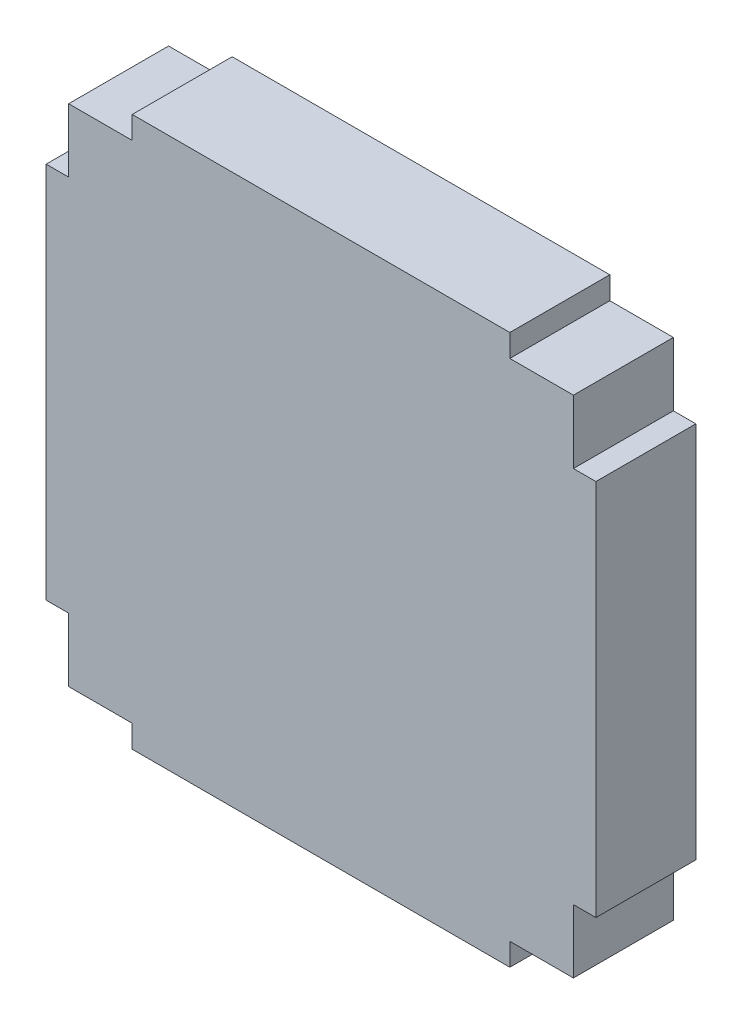
ISO-10303-21;
HEADER;
FILE_DESCRIPTION(('STEP AP214'),'2;1');
FILE_NAME('part.step','',(''),(''),'','','');
FILE_SCHEMA(('AUTOMOTIVE_DESIGN { 1 0 10303 214 1 1 1 1 }'));
ENDSEC;
DATA;
#1=APPLICATION_CONTEXT('core data for automotive mechanical design processes');
#2=APPLICATION_PROTOCOL_DEFINITION('international standard','automotive_design',2000,#1);
#3=PRODUCT_CONTEXT('',#1,'mechanical');
#4=PRODUCT('Part','Part','',(#3));
#5=PRODUCT_RELATED_PRODUCT_CATEGORY('part','',(#4));
#6=PRODUCT_DEFINITION_FORMATION('','',#4);
#7=PRODUCT_DEFINITION_CONTEXT('part definition',#1,'design');
#8=PRODUCT_DEFINITION('design','',#6,#7);
#9=PRODUCT_DEFINITION_SHAPE('','',#8);
#10=(LENGTH_UNIT() NAMED_UNIT(*) SI_UNIT(.MILLI.,.METRE.));
#11=(NAMED_UNIT(*) PLANE_ANGLE_UNIT() SI_UNIT($,.RADIAN.));
#12=(NAMED_UNIT(*) SI_UNIT($,.STERADIAN.) SOLID_ANGLE_UNIT());
#13=UNCERTAINTY_MEASURE_WITH_UNIT(LENGTH_MEASURE(1.E-05),#10,'distance_accuracy_value','');
#14=(GEOMETRIC_REPRESENTATION_CONTEXT(3) GLOBAL_UNCERTAINTY_ASSIGNED_CONTEXT((#13)) GLOBAL_UNIT_ASSIGNED_CONTEXT((#10,
#11,#12)) REPRESENTATION_CONTEXT('',''));
#15=CARTESIAN_POINT('',(0.,0.,0.));
#16=DIRECTION('',(0.,0.,1.));
#17=DIRECTION('',(1.,0.,0.));
#18=AXIS2_PLACEMENT_3D('',#15,#16,#17);
#19=CARTESIAN_POINT('',(0.,0.,1.));
#20=DIRECTION('',(0.,0.,1.));
#21=DIRECTION('',(1.,0.,0.));
#22=AXIS2_PLACEMENT_3D('',#19,#20,#21);
#23=PLANE('',#22);
#24=DIRECTION('',(0.,1.,0.));
#25=VECTOR('',#24,1.);
#26=CARTESIAN_POINT('',(-1.889,0.,1.));
#27=LINE('',#26,#25);
#28=CARTESIAN_POINT('',(-1.889,-2.525,1.));
#29=VERTEX_POINT('',#28);
#30=CARTESIAN_POINT('',(-1.889,-2.75,1.));
#31=VERTEX_POINT('',#30);
#32=EDGE_CURVE('E172',#29,#31,#27,.F.);
#33=ORIENTED_EDGE('',*,*,#32,.T.);
#34=DIRECTION('',(1.,0.,0.));
#35=VECTOR('',#34,1.);
#36=CARTESIAN_POINT('',(-1.889,-2.75,1.));
#37=LINE('',#36,#35);
#38=CARTESIAN_POINT('',(1.889,-2.75,1.));
#39=VERTEX_POINT('',#38);
#40=EDGE_CURVE('E176',#39,#31,#37,.F.);
#41=ORIENTED_EDGE('',*,*,#40,.F.);
#42=DIRECTION('',(0.,1.,0.));
#43=VECTOR('',#42,1.);
#44=CARTESIAN_POINT('',(1.889,-2.75,1.));
#45=LINE('',#44,#43);
#46=CARTESIAN_POINT('',(1.889,-2.525,1.));
#47=VERTEX_POINT('',#46);
#48=EDGE_CURVE('E179',#47,#39,#45,.F.);
#49=ORIENTED_EDGE('',*,*,#48,.F.);
#50=DIRECTION('',(1.,0.,0.));
#51=VECTOR('',#50,1.);
#52=CARTESIAN_POINT('',(1.889,-2.525,1.));
#53=LINE('',#52,#51);
#54=CARTESIAN_POINT('',(2.525,-2.525,1.));
#55=VERTEX_POINT('',#54);
#56=EDGE_CURVE('E183',#55,#47,#53,.F.);
#57=ORIENTED_EDGE('',*,*,#56,.F.);
#58=DIRECTION('',(0.,1.,0.));
#59=VECTOR('',#58,1.);
#60=CARTESIAN_POINT('',(2.525,-2.525,1.));
#61=LINE('',#60,#59);
#62=CARTESIAN_POINT('',(2.525,-1.889,1.));
#63=VERTEX_POINT('',#62);
#64=EDGE_CURVE('E187',#63,#55,#61,.F.);
#65=ORIENTED_EDGE('',*,*,#64,.F.);
#66=DIRECTION('',(1.,0.,0.));
#67=VECTOR('',#66,1.);
#68=CARTESIAN_POINT('',(2.525,-1.889,1.));
#69=LINE('',#68,#67);
#70=CARTESIAN_POINT('',(2.75,-1.889,1.));
#71=VERTEX_POINT('',#70);
#72=EDGE_CURVE('E191',#71,#63,#69,.F.);
#73=ORIENTED_EDGE('',*,*,#72,.F.);
#74=DIRECTION('',(0.,1.,0.));
#75=VECTOR('',#74,1.);
#76=CARTESIAN_POINT('',(2.75,-1.889,1.));
#77=LINE('',#76,#75);
#78=CARTESIAN_POINT('',(2.75,1.889,1.));
#79=VERTEX_POINT('',#78);
#80=EDGE_CURVE('E195',#79,#71,#77,.F.);
#81=ORIENTED_EDGE('',*,*,#80,.F.);
#82=DIRECTION('',(1.,0.,0.));
#83=VECTOR('',#82,1.);
#84=CARTESIAN_POINT('',(2.75,1.889,1.));
#85=LINE('',#84,#83);
#86=CARTESIAN_POINT('',(2.525,1.889,1.));
#87=VERTEX_POINT('',#86);
#88=EDGE_CURVE('E199',#87,#79,#85,.T.);
#89=ORIENTED_EDGE('',*,*,#88,.F.);
#90=DIRECTION('',(0.,1.,0.));
#91=VECTOR('',#90,1.);
#92=CARTESIAN_POINT('',(2.525,1.889,1.));
#93=LINE('',#92,#91);
#94=CARTESIAN_POINT('',(2.525,2.525,1.));
#95=VERTEX_POINT('',#94);
#96=EDGE_CURVE('E203',#95,#87,#93,.F.);
#97=ORIENTED_EDGE('',*,*,#96,.F.);
#98=DIRECTION('',(1.,0.,0.));
#99=VECTOR('',#98,1.);
#100=CARTESIAN_POINT('',(2.525,2.525,1.));
#101=LINE('',#100,#99);
#102=CARTESIAN_POINT('',(1.889,2.525,1.));
#103=VERTEX_POINT('',#102);
#104=EDGE_CURVE('E207',#103,#95,#101,.T.);
#105=ORIENTED_EDGE('',*,*,#104,.F.);
#106=DIRECTION('',(0.,1.,0.));
#107=VECTOR('',#106,1.);
#108=CARTESIAN_POINT('',(1.889,2.525,1.));
#109=LINE('',#108,#107);
#110=CARTESIAN_POINT('',(1.889,2.75,1.));
#111=VERTEX_POINT('',#110);
#112=EDGE_CURVE('E211',#111,#103,#109,.F.);
#113=ORIENTED_EDGE('',*,*,#112,.F.);
#114=DIRECTION('',(1.,0.,0.));
#115=VECTOR('',#114,1.);
#116=CARTESIAN_POINT('',(1.889,2.75,1.));
#117=LINE('',#116,#115);
#118=CARTESIAN_POINT('',(-1.889,2.75,1.));
#119=VERTEX_POINT('',#118);
#120=EDGE_CURVE('E215',#119,#111,#117,.T.);
#121=ORIENTED_EDGE('',*,*,#120,.F.);
#122=DIRECTION('',(0.,1.,0.));
#123=VECTOR('',#122,1.);
#124=CARTESIAN_POINT('',(-1.889,2.75,1.));
#125=LINE('',#124,#123);
#126=CARTESIAN_POINT('',(-1.889,2.525,1.));
#127=VERTEX_POINT('',#126);
#128=EDGE_CURVE('E219',#127,#119,#125,.T.);
#129=ORIENTED_EDGE('',*,*,#128,.F.);
#130=DIRECTION('',(1.,0.,0.));
#131=VECTOR('',#130,1.);
#132=CARTESIAN_POINT('',(-1.889,2.525,1.));
#133=LINE('',#132,#131);
#134=CARTESIAN_POINT('',(-2.525,2.525,1.));
#135=VERTEX_POINT('',#134);
#136=EDGE_CURVE('E223',#135,#127,#133,.T.);
#137=ORIENTED_EDGE('',*,*,#136,.F.);
#138=DIRECTION('',(0.,1.,0.));
#139=VECTOR('',#138,1.);
#140=CARTESIAN_POINT('',(-2.525,2.525,1.));
#141=LINE('',#140,#139);
#142=CARTESIAN_POINT('',(-2.525,1.889,1.));
#143=VERTEX_POINT('',#142);
#144=EDGE_CURVE('E227',#143,#135,#141,.T.);
#145=ORIENTED_EDGE('',*,*,#144,.F.);
#146=DIRECTION('',(1.,0.,0.));
#147=VECTOR('',#146,1.);
#148=CARTESIAN_POINT('',(-2.525,1.889,1.));
#149=LINE('',#148,#147);
#150=CARTESIAN_POINT('',(-2.75,1.889,1.));
#151=VERTEX_POINT('',#150);
#152=EDGE_CURVE('E231',#151,#143,#149,.T.);
#153=ORIENTED_EDGE('',*,*,#152,.F.);
#154=DIRECTION('',(0.,1.,0.));
#155=VECTOR('',#154,1.);
#156=CARTESIAN_POINT('',(-2.75,1.889,1.));
#157=LINE('',#156,#155);
#158=CARTESIAN_POINT('',(-2.75,-1.889,1.));
#159=VERTEX_POINT('',#158);
#160=EDGE_CURVE('E155',#159,#151,#157,.T.);
#161=ORIENTED_EDGE('',*,*,#160,.F.);
#162=DIRECTION('',(1.,0.,0.));
#163=VECTOR('',#162,1.);
#164=CARTESIAN_POINT('',(0.,-1.889,1.));
#165=LINE('',#164,#163);
#166=CARTESIAN_POINT('',(-2.525,-1.889,1.));
#167=VERTEX_POINT('',#166);
#168=EDGE_CURVE('E19',#159,#167,#165,.T.);
#169=ORIENTED_EDGE('',*,*,#168,.T.);
#170=DIRECTION('',(0.,1.,0.));
#171=VECTOR('',#170,1.);
#172=CARTESIAN_POINT('',(-2.525,0.,1.));
#173=LINE('',#172,#171);
#174=CARTESIAN_POINT('',(-2.525,-2.525,1.));
#175=VERTEX_POINT('',#174);
#176=EDGE_CURVE('E150',#167,#175,#173,.F.);
#177=ORIENTED_EDGE('',*,*,#176,.T.);
#178=DIRECTION('',(1.,0.,0.));
#179=VECTOR('',#178,1.);
#180=CARTESIAN_POINT('',(0.,-2.525,1.));
#181=LINE('',#180,#179);
#182=EDGE_CURVE('E171',#175,#29,#181,.T.);
#183=ORIENTED_EDGE('',*,*,#182,.T.);
#184=EDGE_LOOP('',(#33,#41,#49,#57,#65,#73,#81,#89,#97,#105,#113,#121,#129,#137,#145,#153,#161,
#169,#177,#183));
#185=FACE_BOUND('',#184,.T.);
#186=ADVANCED_FACE('F16',(#185),#23,.T.);
#187=CARTESIAN_POINT('',(-1.889,-2.75,0.));
#188=DIRECTION('',(0.,-1.,0.));
#189=DIRECTION('',(0.,0.,-1.));
#190=AXIS2_PLACEMENT_3D('',#187,#188,#189);
#191=PLANE('',#190);
#192=DIRECTION('',(0.,0.,1.));
#193=VECTOR('',#192,1.);
#194=CARTESIAN_POINT('',(-1.889,-2.75,0.));
#195=LINE('',#194,#193);
#196=CARTESIAN_POINT('',(-1.889,-2.75,0.));
#197=VERTEX_POINT('',#196);
#198=EDGE_CURVE('E240',#197,#31,#195,.T.);
#199=ORIENTED_EDGE('',*,*,#198,.F.);
#200=DIRECTION('',(1.,0.,0.));
#201=VECTOR('',#200,1.);
#202=CARTESIAN_POINT('',(0.,-2.75,0.));
#203=LINE('',#202,#201);
#204=CARTESIAN_POINT('',(1.889,-2.75,0.));
#205=VERTEX_POINT('',#204);
#206=EDGE_CURVE('E244',#197,#205,#203,.T.);
#207=ORIENTED_EDGE('',*,*,#206,.T.);
#208=DIRECTION('',(0.,0.,-1.));
#209=VECTOR('',#208,1.);
#210=CARTESIAN_POINT('',(1.889,-2.75,0.));
#211=LINE('',#210,#209);
#212=EDGE_CURVE('E181',#39,#205,#211,.T.);
#213=ORIENTED_EDGE('',*,*,#212,.F.);
#214=ORIENTED_EDGE('',*,*,#40,.T.);
#215=EDGE_LOOP('',(#199,#207,#213,#214));
#216=FACE_BOUND('',#215,.T.);
#217=ADVANCED_FACE('F305',(#216),#191,.T.);
#218=CARTESIAN_POINT('',(1.889,-2.75,0.));
#219=DIRECTION('',(1.,0.,0.));
#220=DIRECTION('',(0.,0.,-1.));
#221=AXIS2_PLACEMENT_3D('',#218,#219,#220);
#222=PLANE('',#221);
#223=ORIENTED_EDGE('',*,*,#212,.T.);
#224=DIRECTION('',(0.,1.,0.));
#225=VECTOR('',#224,1.);
#226=CARTESIAN_POINT('',(1.889,0.,0.));
#227=LINE('',#226,#225);
#228=CARTESIAN_POINT('',(1.889,-2.525,0.));
#229=VERTEX_POINT('',#228);
#230=EDGE_CURVE('E247',#205,#229,#227,.T.);
#231=ORIENTED_EDGE('',*,*,#230,.T.);
#232=DIRECTION('',(0.,0.,-1.));
#233=VECTOR('',#232,1.);
#234=CARTESIAN_POINT('',(1.889,-2.525,0.));
#235=LINE('',#234,#233);
#236=EDGE_CURVE('E185',#47,#229,#235,.T.);
#237=ORIENTED_EDGE('',*,*,#236,.F.);
#238=ORIENTED_EDGE('',*,*,#48,.T.);
#239=EDGE_LOOP('',(#223,#231,#237,#238));
#240=FACE_BOUND('',#239,.T.);
#241=ADVANCED_FACE('F314',(#240),#222,.T.);
#242=CARTESIAN_POINT('',(1.889,-2.525,0.));
#243=DIRECTION('',(0.,-1.,0.));
#244=DIRECTION('',(0.,0.,-1.));
#245=AXIS2_PLACEMENT_3D('',#242,#243,#244);
#246=PLANE('',#245);
#247=ORIENTED_EDGE('',*,*,#236,.T.);
#248=DIRECTION('',(1.,0.,0.));
#249=VECTOR('',#248,1.);
#250=CARTESIAN_POINT('',(0.,-2.525,0.));
#251=LINE('',#250,#249);
#252=CARTESIAN_POINT('',(2.525,-2.525,0.));
#253=VERTEX_POINT('',#252);
#254=EDGE_CURVE('E250',#229,#253,#251,.T.);
#255=ORIENTED_EDGE('',*,*,#254,.T.);
#256=DIRECTION('',(0.,0.,-1.));
#257=VECTOR('',#256,1.);
#258=CARTESIAN_POINT('',(2.525,-2.525,0.));
#259=LINE('',#258,#257);
#260=EDGE_CURVE('E189',#55,#253,#259,.T.);
#261=ORIENTED_EDGE('',*,*,#260,.F.);
#262=ORIENTED_EDGE('',*,*,#56,.T.);
#263=EDGE_LOOP('',(#247,#255,#261,#262));
#264=FACE_BOUND('',#263,.T.);
#265=ADVANCED_FACE('F317',(#264),#246,.T.);
#266=CARTESIAN_POINT('',(2.525,-2.525,0.));
#267=DIRECTION('',(1.,0.,0.));
#268=DIRECTION('',(0.,0.,-1.));
#269=AXIS2_PLACEMENT_3D('',#266,#267,#268);
#270=PLANE('',#269);
#271=ORIENTED_EDGE('',*,*,#260,.T.);
#272=DIRECTION('',(0.,1.,0.));
#273=VECTOR('',#272,1.);
#274=CARTESIAN_POINT('',(2.525,0.,0.));
#275=LINE('',#274,#273);
#276=CARTESIAN_POINT('',(2.525,-1.889,0.));
#277=VERTEX_POINT('',#276);
#278=EDGE_CURVE('E253',#253,#277,#275,.T.);
#279=ORIENTED_EDGE('',*,*,#278,.T.);
#280=DIRECTION('',(0.,0.,-1.));
#281=VECTOR('',#280,1.);
#282=CARTESIAN_POINT('',(2.525,-1.889,0.));
#283=LINE('',#282,#281);
#284=EDGE_CURVE('E193',#63,#277,#283,.T.);
#285=ORIENTED_EDGE('',*,*,#284,.F.);
#286=ORIENTED_EDGE('',*,*,#64,.T.);
#287=EDGE_LOOP('',(#271,#279,#285,#286));
#288=FACE_BOUND('',#287,.T.);
#289=ADVANCED_FACE('F323',(#288),#270,.T.);
#290=CARTESIAN_POINT('',(2.525,-1.889,0.));
#291=DIRECTION('',(0.,-1.,0.));
#292=DIRECTION('',(0.,0.,-1.));
#293=AXIS2_PLACEMENT_3D('',#290,#291,#292);
#294=PLANE('',#293);
#295=ORIENTED_EDGE('',*,*,#284,.T.);
#296=DIRECTION('',(1.,0.,0.));
#297=VECTOR('',#296,1.);
#298=CARTESIAN_POINT('',(0.,-1.889,0.));
#299=LINE('',#298,#297);
#300=CARTESIAN_POINT('',(2.75,-1.889,0.));
#301=VERTEX_POINT('',#300);
#302=EDGE_CURVE('E256',#277,#301,#299,.T.);
#303=ORIENTED_EDGE('',*,*,#302,.T.);
#304=DIRECTION('',(0.,0.,-1.));
#305=VECTOR('',#304,1.);
#306=CARTESIAN_POINT('',(2.75,-1.889,0.));
#307=LINE('',#306,#305);
#308=EDGE_CURVE('E197',#71,#301,#307,.T.);
#309=ORIENTED_EDGE('',*,*,#308,.F.);
#310=ORIENTED_EDGE('',*,*,#72,.T.);
#311=EDGE_LOOP('',(#295,#303,#309,#310));
#312=FACE_BOUND('',#311,.T.);
#313=ADVANCED_FACE('F330',(#312),#294,.T.);
#314=CARTESIAN_POINT('',(2.75,-1.889,0.));
#315=DIRECTION('',(1.,0.,0.));
#316=DIRECTION('',(0.,0.,-1.));
#317=AXIS2_PLACEMENT_3D('',#314,#315,#316);
#318=PLANE('',#317);
#319=ORIENTED_EDGE('',*,*,#308,.T.);
#320=DIRECTION('',(0.,1.,0.));
#321=VECTOR('',#320,1.);
#322=CARTESIAN_POINT('',(2.75,0.,0.));
#323=LINE('',#322,#321);
#324=CARTESIAN_POINT('',(2.75,1.889,0.));
#325=VERTEX_POINT('',#324);
#326=EDGE_CURVE('E259',#301,#325,#323,.T.);
#327=ORIENTED_EDGE('',*,*,#326,.T.);
#328=DIRECTION('',(0.,0.,1.));
#329=VECTOR('',#328,1.);
#330=CARTESIAN_POINT('',(2.75,1.889,0.));
#331=LINE('',#330,#329);
#332=EDGE_CURVE('E201',#79,#325,#331,.F.);
#333=ORIENTED_EDGE('',*,*,#332,.F.);
#334=ORIENTED_EDGE('',*,*,#80,.T.);
#335=EDGE_LOOP('',(#319,#327,#333,#334));
#336=FACE_BOUND('',#335,.T.);
#337=ADVANCED_FACE('F332',(#336),#318,.T.);
#338=CARTESIAN_POINT('',(2.75,1.889,0.));
#339=DIRECTION('',(0.,1.,0.));
#340=DIRECTION('',(0.,0.,1.));
#341=AXIS2_PLACEMENT_3D('',#338,#339,#340);
#342=PLANE('',#341);
#343=ORIENTED_EDGE('',*,*,#332,.T.);
#344=DIRECTION('',(1.,0.,0.));
#345=VECTOR('',#344,1.);
#346=CARTESIAN_POINT('',(0.,1.889,0.));
#347=LINE('',#346,#345);
#348=CARTESIAN_POINT('',(2.525,1.889,0.));
#349=VERTEX_POINT('',#348);
#350=EDGE_CURVE('E262',#325,#349,#347,.F.);
#351=ORIENTED_EDGE('',*,*,#350,.T.);
#352=DIRECTION('',(0.,0.,-1.));
#353=VECTOR('',#352,1.);
#354=CARTESIAN_POINT('',(2.525,1.889,0.));
#355=LINE('',#354,#353);
#356=EDGE_CURVE('E205',#87,#349,#355,.T.);
#357=ORIENTED_EDGE('',*,*,#356,.F.);
#358=ORIENTED_EDGE('',*,*,#88,.T.);
#359=EDGE_LOOP('',(#343,#351,#357,#358));
#360=FACE_BOUND('',#359,.T.);
#361=ADVANCED_FACE('F338',(#360),#342,.T.);
#362=CARTESIAN_POINT('',(2.525,1.889,0.));
#363=DIRECTION('',(1.,0.,0.));
#364=DIRECTION('',(0.,0.,-1.));
#365=AXIS2_PLACEMENT_3D('',#362,#363,#364);
#366=PLANE('',#365);
#367=ORIENTED_EDGE('',*,*,#356,.T.);
#368=DIRECTION('',(0.,1.,0.));
#369=VECTOR('',#368,1.);
#370=CARTESIAN_POINT('',(2.525,0.,0.));
#371=LINE('',#370,#369);
#372=CARTESIAN_POINT('',(2.525,2.525,0.));
#373=VERTEX_POINT('',#372);
#374=EDGE_CURVE('E265',#349,#373,#371,.T.);
#375=ORIENTED_EDGE('',*,*,#374,.T.);
#376=DIRECTION('',(0.,0.,1.));
#377=VECTOR('',#376,1.);
#378=CARTESIAN_POINT('',(2.525,2.525,0.));
#379=LINE('',#378,#377);
#380=EDGE_CURVE('E209',#95,#373,#379,.F.);
#381=ORIENTED_EDGE('',*,*,#380,.F.);
#382=ORIENTED_EDGE('',*,*,#96,.T.);
#383=EDGE_LOOP('',(#367,#375,#381,#382));
#384=FACE_BOUND('',#383,.T.);
#385=ADVANCED_FACE('F345',(#384),#366,.T.);
#386=CARTESIAN_POINT('',(2.525,2.525,0.));
#387=DIRECTION('',(0.,1.,0.));
#388=DIRECTION('',(0.,0.,1.));
#389=AXIS2_PLACEMENT_3D('',#386,#387,#388);
#390=PLANE('',#389);
#391=ORIENTED_EDGE('',*,*,#380,.T.);
#392=DIRECTION('',(1.,0.,0.));
#393=VECTOR('',#392,1.);
#394=CARTESIAN_POINT('',(0.,2.525,0.));
#395=LINE('',#394,#393);
#396=CARTESIAN_POINT('',(1.889,2.525,0.));
#397=VERTEX_POINT('',#396);
#398=EDGE_CURVE('E268',#373,#397,#395,.F.);
#399=ORIENTED_EDGE('',*,*,#398,.T.);
#400=DIRECTION('',(0.,0.,-1.));
#401=VECTOR('',#400,1.);
#402=CARTESIAN_POINT('',(1.889,2.525,0.));
#403=LINE('',#402,#401);
#404=EDGE_CURVE('E213',#103,#397,#403,.T.);
#405=ORIENTED_EDGE('',*,*,#404,.F.);
#406=ORIENTED_EDGE('',*,*,#104,.T.);
#407=EDGE_LOOP('',(#391,#399,#405,#406));
#408=FACE_BOUND('',#407,.T.);
#409=ADVANCED_FACE('F347',(#408),#390,.T.);
#410=CARTESIAN_POINT('',(1.889,2.525,0.));
#411=DIRECTION('',(1.,0.,0.));
#412=DIRECTION('',(0.,0.,-1.));
#413=AXIS2_PLACEMENT_3D('',#410,#411,#412);
#414=PLANE('',#413);
#415=ORIENTED_EDGE('',*,*,#404,.T.);
#416=DIRECTION('',(0.,1.,0.));
#417=VECTOR('',#416,1.);
#418=CARTESIAN_POINT('',(1.889,0.,0.));
#419=LINE('',#418,#417);
#420=CARTESIAN_POINT('',(1.889,2.75,0.));
#421=VERTEX_POINT('',#420);
#422=EDGE_CURVE('E271',#397,#421,#419,.T.);
#423=ORIENTED_EDGE('',*,*,#422,.T.);
#424=DIRECTION('',(0.,0.,1.));
#425=VECTOR('',#424,1.);
#426=CARTESIAN_POINT('',(1.889,2.75,0.));
#427=LINE('',#426,#425);
#428=EDGE_CURVE('E217',#111,#421,#427,.F.);
#429=ORIENTED_EDGE('',*,*,#428,.F.);
#430=ORIENTED_EDGE('',*,*,#112,.T.);
#431=EDGE_LOOP('',(#415,#423,#429,#430));
#432=FACE_BOUND('',#431,.T.);
#433=ADVANCED_FACE('F353',(#432),#414,.T.);
#434=CARTESIAN_POINT('',(1.889,2.75,0.));
#435=DIRECTION('',(0.,1.,0.));
#436=DIRECTION('',(0.,0.,1.));
#437=AXIS2_PLACEMENT_3D('',#434,#435,#436);
#438=PLANE('',#437);
#439=ORIENTED_EDGE('',*,*,#428,.T.);
#440=DIRECTION('',(1.,0.,0.));
#441=VECTOR('',#440,1.);
#442=CARTESIAN_POINT('',(0.,2.75,0.));
#443=LINE('',#442,#441);
#444=CARTESIAN_POINT('',(-1.889,2.75,0.));
#445=VERTEX_POINT('',#444);
#446=EDGE_CURVE('E274',#421,#445,#443,.F.);
#447=ORIENTED_EDGE('',*,*,#446,.T.);
#448=DIRECTION('',(0.,0.,1.));
#449=VECTOR('',#448,1.);
#450=CARTESIAN_POINT('',(-1.889,2.75,0.));
#451=LINE('',#450,#449);
#452=EDGE_CURVE('E221',#119,#445,#451,.F.);
#453=ORIENTED_EDGE('',*,*,#452,.F.);
#454=ORIENTED_EDGE('',*,*,#120,.T.);
#455=EDGE_LOOP('',(#439,#447,#453,#454));
#456=FACE_BOUND('',#455,.T.);
#457=ADVANCED_FACE('F360',(#456),#438,.T.);
#458=CARTESIAN_POINT('',(-1.889,2.75,0.));
#459=DIRECTION('',(-1.,0.,0.));
#460=DIRECTION('',(0.,0.,1.));
#461=AXIS2_PLACEMENT_3D('',#458,#459,#460);
#462=PLANE('',#461);
#463=ORIENTED_EDGE('',*,*,#452,.T.);
#464=DIRECTION('',(0.,1.,0.));
#465=VECTOR('',#464,1.);
#466=CARTESIAN_POINT('',(-1.889,0.,0.));
#467=LINE('',#466,#465);
#468=CARTESIAN_POINT('',(-1.889,2.525,0.));
#469=VERTEX_POINT('',#468);
#470=EDGE_CURVE('E277',#445,#469,#467,.F.);
#471=ORIENTED_EDGE('',*,*,#470,.T.);
#472=DIRECTION('',(0.,0.,1.));
#473=VECTOR('',#472,1.);
#474=CARTESIAN_POINT('',(-1.889,2.525,0.));
#475=LINE('',#474,#473);
#476=EDGE_CURVE('E225',#127,#469,#475,.F.);
#477=ORIENTED_EDGE('',*,*,#476,.F.);
#478=ORIENTED_EDGE('',*,*,#128,.T.);
#479=EDGE_LOOP('',(#463,#471,#477,#478));
#480=FACE_BOUND('',#479,.T.);
#481=ADVANCED_FACE('F362',(#480),#462,.T.);
#482=CARTESIAN_POINT('',(-1.889,2.525,0.));
#483=DIRECTION('',(0.,1.,0.));
#484=DIRECTION('',(0.,0.,1.));
#485=AXIS2_PLACEMENT_3D('',#482,#483,#484);
#486=PLANE('',#485);
#487=ORIENTED_EDGE('',*,*,#476,.T.);
#488=DIRECTION('',(1.,0.,0.));
#489=VECTOR('',#488,1.);
#490=CARTESIAN_POINT('',(0.,2.525,0.));
#491=LINE('',#490,#489);
#492=CARTESIAN_POINT('',(-2.525,2.525,0.));
#493=VERTEX_POINT('',#492);
#494=EDGE_CURVE('E280',#469,#493,#491,.F.);
#495=ORIENTED_EDGE('',*,*,#494,.T.);
#496=DIRECTION('',(0.,0.,1.));
#497=VECTOR('',#496,1.);
#498=CARTESIAN_POINT('',(-2.525,2.525,0.));
#499=LINE('',#498,#497);
#500=EDGE_CURVE('E229',#135,#493,#499,.F.);
#501=ORIENTED_EDGE('',*,*,#500,.F.);
#502=ORIENTED_EDGE('',*,*,#136,.T.);
#503=EDGE_LOOP('',(#487,#495,#501,#502));
#504=FACE_BOUND('',#503,.T.);
#505=ADVANCED_FACE('F368',(#504),#486,.T.);
#506=CARTESIAN_POINT('',(-2.525,2.525,0.));
#507=DIRECTION('',(-1.,0.,0.));
#508=DIRECTION('',(0.,0.,1.));
#509=AXIS2_PLACEMENT_3D('',#506,#507,#508);
#510=PLANE('',#509);
#511=ORIENTED_EDGE('',*,*,#500,.T.);
#512=DIRECTION('',(0.,1.,0.));
#513=VECTOR('',#512,1.);
#514=CARTESIAN_POINT('',(-2.525,0.,0.));
#515=LINE('',#514,#513);
#516=CARTESIAN_POINT('',(-2.525,1.889,0.));
#517=VERTEX_POINT('',#516);
#518=EDGE_CURVE('E283',#493,#517,#515,.F.);
#519=ORIENTED_EDGE('',*,*,#518,.T.);
#520=DIRECTION('',(0.,0.,1.));
#521=VECTOR('',#520,1.);
#522=CARTESIAN_POINT('',(-2.525,1.889,0.));
#523=LINE('',#522,#521);
#524=EDGE_CURVE('E233',#143,#517,#523,.F.);
#525=ORIENTED_EDGE('',*,*,#524,.F.);
#526=ORIENTED_EDGE('',*,*,#144,.T.);
#527=EDGE_LOOP('',(#511,#519,#525,#526));
#528=FACE_BOUND('',#527,.T.);
#529=ADVANCED_FACE('F373',(#528),#510,.T.);
#530=CARTESIAN_POINT('',(-2.525,1.889,0.));
#531=DIRECTION('',(0.,1.,0.));
#532=DIRECTION('',(0.,0.,1.));
#533=AXIS2_PLACEMENT_3D('',#530,#531,#532);
#534=PLANE('',#533);
#535=ORIENTED_EDGE('',*,*,#524,.T.);
#536=DIRECTION('',(1.,0.,0.));
#537=VECTOR('',#536,1.);
#538=CARTESIAN_POINT('',(0.,1.889,0.));
#539=LINE('',#538,#537);
#540=CARTESIAN_POINT('',(-2.75,1.889,0.));
#541=VERTEX_POINT('',#540);
#542=EDGE_CURVE('E286',#517,#541,#539,.F.);
#543=ORIENTED_EDGE('',*,*,#542,.T.);
#544=DIRECTION('',(0.,0.,1.));
#545=VECTOR('',#544,1.);
#546=CARTESIAN_POINT('',(-2.75,1.889,0.));
#547=LINE('',#546,#545);
#548=EDGE_CURVE('E236',#151,#541,#547,.F.);
#549=ORIENTED_EDGE('',*,*,#548,.F.);
#550=ORIENTED_EDGE('',*,*,#152,.T.);
#551=EDGE_LOOP('',(#535,#543,#549,#550));
#552=FACE_BOUND('',#551,.T.);
#553=ADVANCED_FACE('F375',(#552),#534,.T.);
#554=CARTESIAN_POINT('',(-2.75,1.889,0.));
#555=DIRECTION('',(-1.,0.,0.));
#556=DIRECTION('',(0.,0.,1.));
#557=AXIS2_PLACEMENT_3D('',#554,#555,#556);
#558=PLANE('',#557);
#559=ORIENTED_EDGE('',*,*,#548,.T.);
#560=DIRECTION('',(0.,1.,0.));
#561=VECTOR('',#560,1.);
#562=CARTESIAN_POINT('',(-2.75,0.,0.));
#563=LINE('',#562,#561);
#564=CARTESIAN_POINT('',(-2.75,-1.889,0.));
#565=VERTEX_POINT('',#564);
#566=EDGE_CURVE('E289',#541,#565,#563,.F.);
#567=ORIENTED_EDGE('',*,*,#566,.T.);
#568=DIRECTION('',(0.,0.,-1.));
#569=VECTOR('',#568,1.);
#570=CARTESIAN_POINT('',(-2.75,-1.889,0.));
#571=LINE('',#570,#569);
#572=EDGE_CURVE('E167',#159,#565,#571,.T.);
#573=ORIENTED_EDGE('',*,*,#572,.F.);
#574=ORIENTED_EDGE('',*,*,#160,.T.);
#575=EDGE_LOOP('',(#559,#567,#573,#574));
#576=FACE_BOUND('',#575,.T.);
#577=ADVANCED_FACE('F378',(#576),#558,.T.);
#578=CARTESIAN_POINT('',(-2.75,-1.889,0.));
#579=DIRECTION('',(0.,-1.,0.));
#580=DIRECTION('',(0.,0.,-1.));
#581=AXIS2_PLACEMENT_3D('',#578,#579,#580);
#582=PLANE('',#581);
#583=ORIENTED_EDGE('',*,*,#572,.T.);
#584=DIRECTION('',(1.,0.,0.));
#585=VECTOR('',#584,1.);
#586=CARTESIAN_POINT('',(0.,-1.889,0.));
#587=LINE('',#586,#585);
#588=CARTESIAN_POINT('',(-2.525,-1.889,0.));
#589=VERTEX_POINT('',#588);
#590=EDGE_CURVE('E162',#565,#589,#587,.T.);
#591=ORIENTED_EDGE('',*,*,#590,.T.);
#592=DIRECTION('',(0.,0.,1.));
#593=VECTOR('',#592,1.);
#594=CARTESIAN_POINT('',(-2.525,-1.889,0.));
#595=LINE('',#594,#593);
#596=EDGE_CURVE('E159',#167,#589,#595,.F.);
#597=ORIENTED_EDGE('',*,*,#596,.F.);
#598=ORIENTED_EDGE('',*,*,#168,.F.);
#599=EDGE_LOOP('',(#583,#591,#597,#598));
#600=FACE_BOUND('',#599,.T.);
#601=ADVANCED_FACE('F160',(#600),#582,.T.);
#602=CARTESIAN_POINT('',(-2.525,-1.889,0.));
#603=DIRECTION('',(-1.,0.,0.));
#604=DIRECTION('',(0.,0.,1.));
#605=AXIS2_PLACEMENT_3D('',#602,#603,#604);
#606=PLANE('',#605);
#607=ORIENTED_EDGE('',*,*,#596,.T.);
#608=DIRECTION('',(0.,1.,0.));
#609=VECTOR('',#608,1.);
#610=CARTESIAN_POINT('',(-2.525,0.,0.));
#611=LINE('',#610,#609);
#612=CARTESIAN_POINT('',(-2.525,-2.525,0.));
#613=VERTEX_POINT('',#612);
#614=EDGE_CURVE('E293',#589,#613,#611,.F.);
#615=ORIENTED_EDGE('',*,*,#614,.T.);
#616=DIRECTION('',(0.,0.,-1.));
#617=VECTOR('',#616,1.);
#618=CARTESIAN_POINT('',(-2.525,-2.525,0.));
#619=LINE('',#618,#617);
#620=EDGE_CURVE('E166',#175,#613,#619,.T.);
#621=ORIENTED_EDGE('',*,*,#620,.F.);
#622=ORIENTED_EDGE('',*,*,#176,.F.);
#623=EDGE_LOOP('',(#607,#615,#621,#622));
#624=FACE_BOUND('',#623,.T.);
#625=ADVANCED_FACE('F169',(#624),#606,.T.);
#626=CARTESIAN_POINT('',(-2.525,-2.525,0.));
#627=DIRECTION('',(0.,-1.,0.));
#628=DIRECTION('',(0.,0.,-1.));
#629=AXIS2_PLACEMENT_3D('',#626,#627,#628);
#630=PLANE('',#629);
#631=ORIENTED_EDGE('',*,*,#620,.T.);
#632=DIRECTION('',(1.,0.,0.));
#633=VECTOR('',#632,1.);
#634=CARTESIAN_POINT('',(0.,-2.525,0.));
#635=LINE('',#634,#633);
#636=CARTESIAN_POINT('',(-1.889,-2.525,0.));
#637=VERTEX_POINT('',#636);
#638=EDGE_CURVE('E25',#613,#637,#635,.T.);
#639=ORIENTED_EDGE('',*,*,#638,.T.);
#640=DIRECTION('',(0.,0.,1.));
#641=VECTOR('',#640,1.);
#642=CARTESIAN_POINT('',(-1.889,-2.525,0.));
#643=LINE('',#642,#641);
#644=EDGE_CURVE('E33',#29,#637,#643,.F.);
#645=ORIENTED_EDGE('',*,*,#644,.F.);
#646=ORIENTED_EDGE('',*,*,#182,.F.);
#647=EDGE_LOOP('',(#631,#639,#645,#646));
#648=FACE_BOUND('',#647,.T.);
#649=ADVANCED_FACE('F298',(#648),#630,.T.);
#650=CARTESIAN_POINT('',(-1.889,-2.525,0.));
#651=DIRECTION('',(-1.,0.,0.));
#652=DIRECTION('',(0.,0.,1.));
#653=AXIS2_PLACEMENT_3D('',#650,#651,#652);
#654=PLANE('',#653);
#655=ORIENTED_EDGE('',*,*,#644,.T.);
#656=DIRECTION('',(0.,1.,0.));
#657=VECTOR('',#656,1.);
#658=CARTESIAN_POINT('',(-1.889,0.,0.));
#659=LINE('',#658,#657);
#660=EDGE_CURVE('E11',#637,#197,#659,.F.);
#661=ORIENTED_EDGE('',*,*,#660,.T.);
#662=ORIENTED_EDGE('',*,*,#198,.T.);
#663=ORIENTED_EDGE('',*,*,#32,.F.);
#664=EDGE_LOOP('',(#655,#661,#662,#663));
#665=FACE_BOUND('',#664,.T.);
#666=ADVANCED_FACE('F303',(#665),#654,.T.);
#667=CARTESIAN_POINT('',(0.,0.,0.));
#668=DIRECTION('',(0.,0.,1.));
#669=DIRECTION('',(1.,0.,0.));
#670=AXIS2_PLACEMENT_3D('',#667,#668,#669);
#671=PLANE('',#670);
#672=ORIENTED_EDGE('',*,*,#638,.F.);
#673=ORIENTED_EDGE('',*,*,#614,.F.);
#674=ORIENTED_EDGE('',*,*,#590,.F.);
#675=ORIENTED_EDGE('',*,*,#566,.F.);
#676=ORIENTED_EDGE('',*,*,#542,.F.);
#677=ORIENTED_EDGE('',*,*,#518,.F.);
#678=ORIENTED_EDGE('',*,*,#494,.F.);
#679=ORIENTED_EDGE('',*,*,#470,.F.);
#680=ORIENTED_EDGE('',*,*,#446,.F.);
#681=ORIENTED_EDGE('',*,*,#422,.F.);
#682=ORIENTED_EDGE('',*,*,#398,.F.);
#683=ORIENTED_EDGE('',*,*,#374,.F.);
#684=ORIENTED_EDGE('',*,*,#350,.F.);
#685=ORIENTED_EDGE('',*,*,#326,.F.);
#686=ORIENTED_EDGE('',*,*,#302,.F.);
#687=ORIENTED_EDGE('',*,*,#278,.F.);
#688=ORIENTED_EDGE('',*,*,#254,.F.);
#689=ORIENTED_EDGE('',*,*,#230,.F.);
#690=ORIENTED_EDGE('',*,*,#206,.F.);
#691=ORIENTED_EDGE('',*,*,#660,.F.);
#692=EDGE_LOOP('',(#672,#673,#674,#675,#676,#677,#678,#679,#680,#681,#682,#683,#684,#685,#686,
#687,#688,#689,#690,#691));
#693=FACE_BOUND('',#692,.T.);
#694=ADVANCED_FACE('F300',(#693),#671,.F.);
#695=CLOSED_SHELL('',(#186,#217,#241,#265,#289,#313,#337,#361,#385,#409,#433,#457,#481,#505,
#529,#553,#577,#601,#625,#649,#666,#694));
#696=MANIFOLD_SOLID_BREP('B1',#695);
#697=ADVANCED_BREP_SHAPE_REPRESENTATION('',(#18,#696),#14);
#698=SHAPE_DEFINITION_REPRESENTATION(#9,#697);
ENDSEC;
END-ISO-10303-21;
